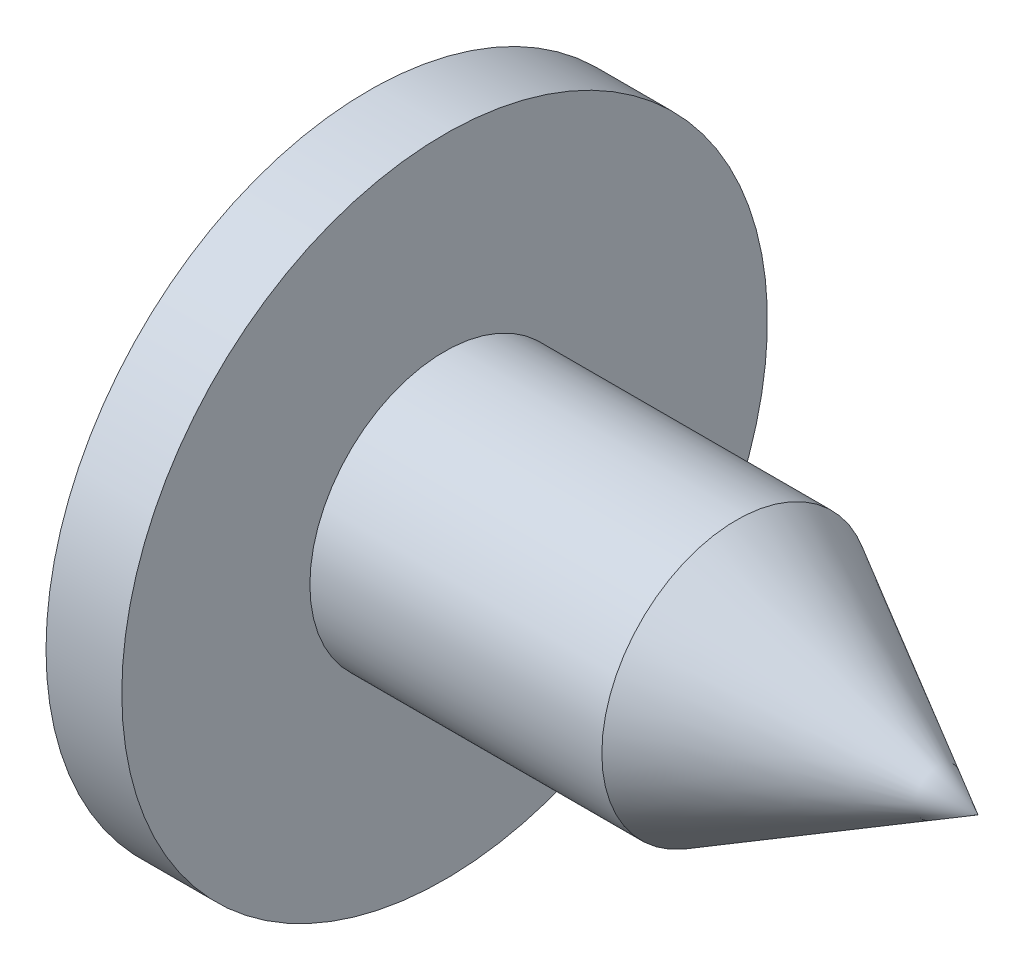
ISO-10303-21;
HEADER;
FILE_DESCRIPTION(('STEP AP214'),'2;1');
FILE_NAME('part.step','',(''),(''),'','','');
FILE_SCHEMA(('AUTOMOTIVE_DESIGN { 1 0 10303 214 1 1 1 1 }'));
ENDSEC;
DATA;
#1=APPLICATION_CONTEXT('core data for automotive mechanical design processes');
#2=APPLICATION_PROTOCOL_DEFINITION('international standard','automotive_design',2000,#1);
#3=PRODUCT_CONTEXT('',#1,'mechanical');
#4=PRODUCT('Part','Part','',(#3));
#5=PRODUCT_RELATED_PRODUCT_CATEGORY('part','',(#4));
#6=PRODUCT_DEFINITION_FORMATION('','',#4);
#7=PRODUCT_DEFINITION_CONTEXT('part definition',#1,'design');
#8=PRODUCT_DEFINITION('design','',#6,#7);
#9=PRODUCT_DEFINITION_SHAPE('','',#8);
#10=(LENGTH_UNIT() NAMED_UNIT(*) SI_UNIT(.MILLI.,.METRE.));
#11=(NAMED_UNIT(*) PLANE_ANGLE_UNIT() SI_UNIT($,.RADIAN.));
#12=(NAMED_UNIT(*) SI_UNIT($,.STERADIAN.) SOLID_ANGLE_UNIT());
#13=UNCERTAINTY_MEASURE_WITH_UNIT(LENGTH_MEASURE(1.E-05),#10,'distance_accuracy_value','');
#14=(GEOMETRIC_REPRESENTATION_CONTEXT(3) GLOBAL_UNCERTAINTY_ASSIGNED_CONTEXT((#13)) GLOBAL_UNIT_ASSIGNED_CONTEXT((#10,
#11,#12)) REPRESENTATION_CONTEXT('',''));
#15=CARTESIAN_POINT('',(0.,0.,0.));
#16=DIRECTION('',(0.,0.,1.));
#17=DIRECTION('',(1.,0.,0.));
#18=AXIS2_PLACEMENT_3D('',#15,#16,#17);
#19=CARTESIAN_POINT('',(3.05,0.,0.));
#20=DIRECTION('',(-1.,0.,0.));
#21=DIRECTION('',(0.,1.,0.));
#22=AXIS2_PLACEMENT_3D('',#19,#20,#21);
#23=SPHERICAL_SURFACE('',#22,6.6);
#24=CARTESIAN_POINT('',(-1.35,0.,0.));
#25=DIRECTION('',(-1.,0.,0.));
#26=DIRECTION('',(0.,0.,1.));
#27=AXIS2_PLACEMENT_3D('',#24,#25,#26);
#28=CIRCLE('',#27,4.91934955049953);
#29=CARTESIAN_POINT('',(-1.35,0.,4.91934955049953));
#30=VERTEX_POINT('',#29);
#31=EDGE_CURVE('E544',#30,#30,#28,.T.);
#32=ORIENTED_EDGE('',*,*,#31,.T.);
#33=EDGE_LOOP('',(#32));
#34=FACE_BOUND('',#33,.T.);
#35=CARTESIAN_POINT('',(2.9910729355507,0.,0.41928785021152));
#36=DIRECTION('',(-0.139173100960066,0.,0.99026806874157));
#37=DIRECTION('',(0.99026806874157,0.,0.139173100960066));
#38=AXIS2_PLACEMENT_3D('',#35,#36,#37);
#39=CIRCLE('',#38,6.58640458062974);
#40=CARTESIAN_POINT('',(-3.46986983546637,-0.901350135100591,-0.488738439791603));
#41=VERTEX_POINT('',#40);
#42=CARTESIAN_POINT('',(-3.14968174112773,-2.21969413745465,-0.443738937751484));
#43=VERTEX_POINT('',#42);
#44=EDGE_CURVE('E262',#41,#43,#39,.T.);
#45=ORIENTED_EDGE('',*,*,#44,.F.);
#46=CARTESIAN_POINT('',(-3.46986983546637,-0.901350135100592,-0.488738439791603));
#47=CARTESIAN_POINT('',(-3.47304924873914,-0.878129830106261,-0.489165172042078));
#48=CARTESIAN_POINT('',(-3.47594920651021,-0.854915698480102,-0.491589177292262));
#49=CARTESIAN_POINT('',(-3.48111988024279,-0.809162194857248,-0.500273532954115));
#50=CARTESIAN_POINT('',(-3.4833910818934,-0.78662231410156,-0.506530910165482));
#51=CARTESIAN_POINT('',(-3.4872399763901,-0.742831209379798,-0.522728852489197));
#52=CARTESIAN_POINT('',(-3.48881733461709,-0.721580611444196,-0.532671190494041));
#53=CARTESIAN_POINT('',(-3.49123292421502,-0.680986066779768,-0.555948097172701));
#54=CARTESIAN_POINT('',(-3.4920712945597,-0.661641762162296,-0.569282027417165));
#55=CARTESIAN_POINT('',(-3.49298537164809,-0.625405010318843,-0.59896565504239));
#56=CARTESIAN_POINT('',(-3.49306109683292,-0.608512503816986,-0.615315279492538));
#57=CARTESIAN_POINT('',(-3.49244767441931,-0.577654389720001,-0.650571089138518));
#58=CARTESIAN_POINT('',(-3.49175834677971,-0.563689471998954,-0.669477875195878));
#59=CARTESIAN_POINT('',(-3.48963421475739,-0.539085453086739,-0.709310040232108));
#60=CARTESIAN_POINT('',(-3.48819922617123,-0.528447174728495,-0.730235916953955));
#61=CARTESIAN_POINT('',(-3.48462426424543,-0.510808283126692,-0.773504118163124));
#62=CARTESIAN_POINT('',(-3.48248480623913,-0.503805020416462,-0.795845397635884));
#63=CARTESIAN_POINT('',(-3.47855104061412,-0.495665160757729,-0.832186870652789));
#64=CARTESIAN_POINT('',(-3.47696131563885,-0.493302356290953,-0.845946594751364));
#65=CARTESIAN_POINT('',(-3.47357041763564,-0.489973133427954,-0.873585550624749));
#66=CARTESIAN_POINT('',(-3.47176958619303,-0.489004492002053,-0.887464556567356));
#67=CARTESIAN_POINT('',(-3.46986983546637,-0.488738439791604,-0.90135013510059));
#68=B_SPLINE_CURVE_WITH_KNOTS('',3,(#46,#47,#48,#49,#50,#51,#52,#53,#54,#55,#56,#57,#58,#59,#60,
#61,#62,#63,#64,#65,#66,#67),.UNSPECIFIED.,.F.,.F.,(4,2,2,2,2,2,2,2,2,2,4),(0.,
0.0702290995303257,0.14040379753497,0.210612301607931,0.280807599482197,0.351001199997685,
0.421211322795477,0.491438798116696,0.56161501435542,0.603703827168205,0.645725453626422),.UNSPECIFIED.);
#69=CARTESIAN_POINT('',(-3.46986983546636,-0.488738439791604,-0.90135013510059));
#70=VERTEX_POINT('',#69);
#71=EDGE_CURVE('E206',#41,#70,#68,.T.);
#72=ORIENTED_EDGE('',*,*,#71,.T.);
#73=CARTESIAN_POINT('',(2.9910729355507,0.419287850211519,0.));
#74=DIRECTION('',(-0.139173100960066,0.99026806874157,0.));
#75=DIRECTION('',(-0.99026806874157,-0.139173100960066,0.));
#76=AXIS2_PLACEMENT_3D('',#73,#74,#75);
#77=CIRCLE('',#76,6.58640458062974);
#78=CARTESIAN_POINT('',(-3.14968174112773,-0.443738937751484,-2.21969413745465));
#79=VERTEX_POINT('',#78);
#80=EDGE_CURVE('E260',#79,#70,#77,.T.);
#81=ORIENTED_EDGE('',*,*,#80,.F.);
#82=CARTESIAN_POINT('',(2.05328224895708,0.,1.42346046943642));
#83=DIRECTION('',(-0.573576436351047,0.,0.819152044288991));
#84=DIRECTION('',(0.819152044288991,0.,0.573576436351047));
#85=AXIS2_PLACEMENT_3D('',#82,#83,#84);
#86=CIRCLE('',#85,6.36712761115307);
#87=CARTESIAN_POINT('',(-3.14968174112774,0.443738937751483,-2.21969413745465));
#88=VERTEX_POINT('',#87);
#89=EDGE_CURVE('E270',#88,#79,#86,.T.);
#90=ORIENTED_EDGE('',*,*,#89,.F.);
#91=CARTESIAN_POINT('',(2.9910729355507,-0.419287850211521,0.));
#92=DIRECTION('',(-0.139173100960066,-0.99026806874157,0.));
#93=DIRECTION('',(0.99026806874157,-0.139173100960066,0.));
#94=AXIS2_PLACEMENT_3D('',#91,#92,#93);
#95=CIRCLE('',#94,6.58640458062974);
#96=CARTESIAN_POINT('',(-3.46986983546637,0.488738439791602,-0.90135013510059));
#97=VERTEX_POINT('',#96);
#98=EDGE_CURVE('E319',#97,#88,#95,.T.);
#99=ORIENTED_EDGE('',*,*,#98,.F.);
#100=CARTESIAN_POINT('',(-3.46986983546637,0.488738439791602,-0.90135013510059));
#101=CARTESIAN_POINT('',(-3.47304924873914,0.489165172042077,-0.87812983010626));
#102=CARTESIAN_POINT('',(-3.47594920651021,0.491589177292261,-0.854915698480101));
#103=CARTESIAN_POINT('',(-3.48111988024279,0.500273532954114,-0.809162194857247));
#104=CARTESIAN_POINT('',(-3.4833910818934,0.506530910165481,-0.786622314101559));
#105=CARTESIAN_POINT('',(-3.4872399763901,0.522728852489197,-0.742831209379798));
#106=CARTESIAN_POINT('',(-3.48881733461709,0.53267119049404,-0.721580611444195));
#107=CARTESIAN_POINT('',(-3.49123292421502,0.5559480971727,-0.680986066779767));
#108=CARTESIAN_POINT('',(-3.4920712945597,0.569282027417164,-0.661641762162295));
#109=CARTESIAN_POINT('',(-3.49298537164809,0.598965655042389,-0.625405010318842));
#110=CARTESIAN_POINT('',(-3.49306109683292,0.615315279492537,-0.608512503816985));
#111=CARTESIAN_POINT('',(-3.49244767441932,0.650571089138517,-0.57765438972));
#112=CARTESIAN_POINT('',(-3.49175834677971,0.669477875195877,-0.563689471998953));
#113=CARTESIAN_POINT('',(-3.48963421475739,0.709310040232107,-0.539085453086738));
#114=CARTESIAN_POINT('',(-3.48819922617123,0.730235916953954,-0.528447174728494));
#115=CARTESIAN_POINT('',(-3.48462426424543,0.773504118163123,-0.51080828312669));
#116=CARTESIAN_POINT('',(-3.48248480623913,0.795845397635882,-0.503805020416461));
#117=CARTESIAN_POINT('',(-3.47855104061412,0.832186870652788,-0.495665160757727));
#118=CARTESIAN_POINT('',(-3.47696131563885,0.845946594751363,-0.493302356290952));
#119=CARTESIAN_POINT('',(-3.47357041763564,0.873585550624749,-0.489973133427953));
#120=CARTESIAN_POINT('',(-3.47176958619303,0.887464556567355,-0.489004492002052));
#121=CARTESIAN_POINT('',(-3.46986983546637,0.90135013510059,-0.488738439791603));
#122=B_SPLINE_CURVE_WITH_KNOTS('',3,(#100,#101,#102,#103,#104,#105,#106,#107,#108,#109,#110,
#111,#112,#113,#114,#115,#116,#117,#118,#119,#120,#121),.UNSPECIFIED.,.F.,.F.,(4,2,2,2,2,2,2,2,
2,2,4),(0.,0.0702290995303255,0.14040379753497,0.210612301607931,0.280807599482197,
0.351001199997685,0.421211322795477,0.491438798116695,0.56161501435542,0.603703827168205,
0.645725453626423),.UNSPECIFIED.);
#123=CARTESIAN_POINT('',(-3.46986983546637,0.90135013510059,-0.488738439791603));
#124=VERTEX_POINT('',#123);
#125=EDGE_CURVE('E185',#97,#124,#122,.T.);
#126=ORIENTED_EDGE('',*,*,#125,.T.);
#127=CARTESIAN_POINT('',(2.9910729355507,0.,0.41928785021152));
#128=DIRECTION('',(-0.139173100960066,0.,0.99026806874157));
#129=DIRECTION('',(0.99026806874157,0.,0.139173100960066));
#130=AXIS2_PLACEMENT_3D('',#127,#128,#129);
#131=CIRCLE('',#130,6.58640458062974);
#132=CARTESIAN_POINT('',(-3.14968174112773,2.21969413745465,-0.443738937751484));
#133=VERTEX_POINT('',#132);
#134=EDGE_CURVE('E297',#133,#124,#131,.T.);
#135=ORIENTED_EDGE('',*,*,#134,.F.);
#136=CARTESIAN_POINT('',(2.05328224895708,-1.42346046943642,0.));
#137=DIRECTION('',(-0.573576436351047,-0.819152044288991,0.));
#138=DIRECTION('',(0.819152044288991,-0.573576436351047,0.));
#139=AXIS2_PLACEMENT_3D('',#136,#137,#138);
#140=CIRCLE('',#139,6.36712761115307);
#141=CARTESIAN_POINT('',(-3.14968174112773,2.21969413745465,0.443738937751484));
#142=VERTEX_POINT('',#141);
#143=EDGE_CURVE('E298',#142,#133,#140,.T.);
#144=ORIENTED_EDGE('',*,*,#143,.F.);
#145=CARTESIAN_POINT('',(2.9910729355507,0.,-0.41928785021152));
#146=DIRECTION('',(-0.139173100960066,0.,-0.99026806874157));
#147=DIRECTION('',(-0.99026806874157,0.,0.139173100960066));
#148=AXIS2_PLACEMENT_3D('',#145,#146,#147);
#149=CIRCLE('',#148,6.58640458062974);
#150=CARTESIAN_POINT('',(-3.46986983546637,0.90135013510059,0.488738439791603));
#151=VERTEX_POINT('',#150);
#152=EDGE_CURVE('E302',#151,#142,#149,.T.);
#153=ORIENTED_EDGE('',*,*,#152,.F.);
#154=CARTESIAN_POINT('',(-3.46986983546637,0.90135013510059,0.488738439791603));
#155=CARTESIAN_POINT('',(-3.47304924873914,0.87812983010626,0.489165172042078));
#156=CARTESIAN_POINT('',(-3.47594920651021,0.8549156984801,0.491589177292262));
#157=CARTESIAN_POINT('',(-3.48111988024279,0.809162194857247,0.500273532954114));
#158=CARTESIAN_POINT('',(-3.4833910818934,0.786622314101558,0.506530910165482));
#159=CARTESIAN_POINT('',(-3.4872399763901,0.742831209379797,0.522728852489197));
#160=CARTESIAN_POINT('',(-3.48881733461709,0.721580611444194,0.532671190494041));
#161=CARTESIAN_POINT('',(-3.49123292421502,0.680986066779766,0.555948097172701));
#162=CARTESIAN_POINT('',(-3.4920712945597,0.661641762162295,0.569282027417165));
#163=CARTESIAN_POINT('',(-3.49298537164809,0.625405010318841,0.59896565504239));
#164=CARTESIAN_POINT('',(-3.49306109683292,0.608512503816985,0.615315279492538));
#165=CARTESIAN_POINT('',(-3.49244767441932,0.577654389719999,0.650571089138518));
#166=CARTESIAN_POINT('',(-3.49175834677971,0.563689471998952,0.669477875195877));
#167=CARTESIAN_POINT('',(-3.48963421475739,0.539085453086738,0.709310040232107));
#168=CARTESIAN_POINT('',(-3.48819922617123,0.528447174728493,0.730235916953954));
#169=CARTESIAN_POINT('',(-3.48462426424543,0.51080828312669,0.773504118163123));
#170=CARTESIAN_POINT('',(-3.48248480623913,0.50380502041646,0.795845397635883));
#171=CARTESIAN_POINT('',(-3.47855104061412,0.495665160757727,0.832186870652789));
#172=CARTESIAN_POINT('',(-3.47696131563885,0.493302356290952,0.845946594751364));
#173=CARTESIAN_POINT('',(-3.47357041763564,0.489973133427952,0.873585550624749));
#174=CARTESIAN_POINT('',(-3.47176958619303,0.489004492002051,0.887464556567356));
#175=CARTESIAN_POINT('',(-3.46986983546637,0.488738439791602,0.90135013510059));
#176=B_SPLINE_CURVE_WITH_KNOTS('',3,(#154,#155,#156,#157,#158,#159,#160,#161,#162,#163,#164,
#165,#166,#167,#168,#169,#170,#171,#172,#173,#174,#175),.UNSPECIFIED.,.F.,.F.,(4,2,2,2,2,2,2,2,
2,2,4),(0.,0.0702290995303257,0.14040379753497,0.210612301607931,0.280807599482197,
0.351001199997685,0.421211322795477,0.491438798116695,0.56161501435542,0.603703827168205,
0.645725453626422),.UNSPECIFIED.);
#177=CARTESIAN_POINT('',(-3.46986983546637,0.488738439791602,0.90135013510059));
#178=VERTEX_POINT('',#177);
#179=EDGE_CURVE('E194',#151,#178,#176,.T.);
#180=ORIENTED_EDGE('',*,*,#179,.T.);
#181=CARTESIAN_POINT('',(2.9910729355507,-0.419287850211521,0.));
#182=DIRECTION('',(-0.139173100960066,-0.99026806874157,0.));
#183=DIRECTION('',(0.99026806874157,-0.139173100960066,0.));
#184=AXIS2_PLACEMENT_3D('',#181,#182,#183);
#185=CIRCLE('',#184,6.58640458062974);
#186=CARTESIAN_POINT('',(-3.14968174112774,0.443738937751483,2.21969413745465));
#187=VERTEX_POINT('',#186);
#188=EDGE_CURVE('E322',#187,#178,#185,.T.);
#189=ORIENTED_EDGE('',*,*,#188,.F.);
#190=CARTESIAN_POINT('',(2.05328224895708,0.,-1.42346046943642));
#191=DIRECTION('',(-0.573576436351047,0.,-0.819152044288991));
#192=DIRECTION('',(-0.819152044288991,0.,0.573576436351047));
#193=AXIS2_PLACEMENT_3D('',#190,#191,#192);
#194=CIRCLE('',#193,6.36712761115307);
#195=CARTESIAN_POINT('',(-3.14968174112773,-0.443738937751484,2.21969413745465));
#196=VERTEX_POINT('',#195);
#197=EDGE_CURVE('E325',#196,#187,#194,.T.);
#198=ORIENTED_EDGE('',*,*,#197,.F.);
#199=CARTESIAN_POINT('',(2.9910729355507,0.419287850211519,0.));
#200=DIRECTION('',(-0.139173100960066,0.99026806874157,0.));
#201=DIRECTION('',(-0.99026806874157,-0.139173100960066,0.));
#202=AXIS2_PLACEMENT_3D('',#199,#200,#201);
#203=CIRCLE('',#202,6.58640458062974);
#204=CARTESIAN_POINT('',(-3.46986983546636,-0.488738439791604,0.90135013510059));
#205=VERTEX_POINT('',#204);
#206=EDGE_CURVE('E341',#205,#196,#203,.T.);
#207=ORIENTED_EDGE('',*,*,#206,.F.);
#208=CARTESIAN_POINT('',(-3.46986983546637,-0.488738439791604,0.90135013510059));
#209=CARTESIAN_POINT('',(-3.47304924873914,-0.489165172042079,0.87812983010626));
#210=CARTESIAN_POINT('',(-3.47594920651021,-0.491589177292263,0.8549156984801));
#211=CARTESIAN_POINT('',(-3.48111988024279,-0.500273532954116,0.809162194857247));
#212=CARTESIAN_POINT('',(-3.4833910818934,-0.506530910165483,0.786622314101558));
#213=CARTESIAN_POINT('',(-3.4872399763901,-0.522728852489199,0.742831209379797));
#214=CARTESIAN_POINT('',(-3.48881733461709,-0.532671190494042,0.721580611444195));
#215=CARTESIAN_POINT('',(-3.49123292421502,-0.555948097172703,0.680986066779767));
#216=CARTESIAN_POINT('',(-3.4920712945597,-0.569282027417167,0.661641762162295));
#217=CARTESIAN_POINT('',(-3.49298537164809,-0.598965655042391,0.625405010318841));
#218=CARTESIAN_POINT('',(-3.49306109683292,-0.615315279492539,0.608512503816985));
#219=CARTESIAN_POINT('',(-3.49244767441931,-0.65057108913852,0.577654389719999));
#220=CARTESIAN_POINT('',(-3.49175834677971,-0.669477875195879,0.563689471998952));
#221=CARTESIAN_POINT('',(-3.48963421475739,-0.709310040232109,0.539085453086738));
#222=CARTESIAN_POINT('',(-3.48819922617123,-0.730235916953956,0.528447174728494));
#223=CARTESIAN_POINT('',(-3.48462426424543,-0.773504118163125,0.51080828312669));
#224=CARTESIAN_POINT('',(-3.48248480623913,-0.795845397635885,0.503805020416461));
#225=CARTESIAN_POINT('',(-3.47855104061412,-0.832186870652791,0.495665160757727));
#226=CARTESIAN_POINT('',(-3.47696131563885,-0.845946594751365,0.493302356290952));
#227=CARTESIAN_POINT('',(-3.47357041763564,-0.87358555062475,0.489973133427952));
#228=CARTESIAN_POINT('',(-3.47176958619303,-0.887464556567357,0.489004492002051));
#229=CARTESIAN_POINT('',(-3.46986983546637,-0.901350135100592,0.488738439791602));
#230=B_SPLINE_CURVE_WITH_KNOTS('',3,(#208,#209,#210,#211,#212,#213,#214,#215,#216,#217,#218,
#219,#220,#221,#222,#223,#224,#225,#226,#227,#228,#229),.UNSPECIFIED.,.F.,.F.,(4,2,2,2,2,2,2,2,
2,2,4),(0.,0.0702290995303255,0.14040379753497,0.210612301607931,0.280807599482197,
0.351001199997685,0.421211322795477,0.491438798116695,0.56161501435542,0.603703827168205,
0.645725453626422),.UNSPECIFIED.);
#231=CARTESIAN_POINT('',(-3.46986983546637,-0.901350135100592,0.488738439791603));
#232=VERTEX_POINT('',#231);
#233=EDGE_CURVE('E200',#205,#232,#230,.T.);
#234=ORIENTED_EDGE('',*,*,#233,.T.);
#235=CARTESIAN_POINT('',(2.9910729355507,0.,-0.41928785021152));
#236=DIRECTION('',(-0.139173100960066,0.,-0.99026806874157));
#237=DIRECTION('',(-0.99026806874157,0.,0.139173100960066));
#238=AXIS2_PLACEMENT_3D('',#235,#236,#237);
#239=CIRCLE('',#238,6.58640458062974);
#240=CARTESIAN_POINT('',(-3.14968174112773,-2.21969413745465,0.443738937751483));
#241=VERTEX_POINT('',#240);
#242=EDGE_CURVE('E338',#241,#232,#239,.T.);
#243=ORIENTED_EDGE('',*,*,#242,.F.);
#244=CARTESIAN_POINT('',(2.05328224895709,1.42346046943642,0.));
#245=DIRECTION('',(-0.573576436351047,0.819152044288991,0.));
#246=DIRECTION('',(-0.819152044288991,-0.573576436351047,0.));
#247=AXIS2_PLACEMENT_3D('',#244,#245,#246);
#248=CIRCLE('',#247,6.36712761115307);
#249=EDGE_CURVE('E296',#43,#241,#248,.T.);
#250=ORIENTED_EDGE('',*,*,#249,.F.);
#251=EDGE_LOOP('',(#45,#72,#81,#90,#99,#126,#135,#144,#153,#180,#189,#198,#207,#234,#243,#250));
#252=FACE_BOUND('',#251,.T.);
#253=ADVANCED_FACE('F35',(#34,#252),#23,.T.);
#254=CARTESIAN_POINT('',(-6.47830998605592,0.,0.));
#255=DIRECTION('',(-1.,0.,0.));
#256=DIRECTION('',(0.,0.,1.));
#257=AXIS2_PLACEMENT_3D('',#254,#255,#256);
#258=CYLINDRICAL_SURFACE('',#257,5.75);
#259=CARTESIAN_POINT('',(-1.35,0.,0.));
#260=DIRECTION('',(-1.,0.,0.));
#261=DIRECTION('',(0.,0.,1.));
#262=AXIS2_PLACEMENT_3D('',#259,#260,#261);
#263=CIRCLE('',#262,5.75);
#264=CARTESIAN_POINT('',(-1.35,0.,5.75));
#265=VERTEX_POINT('',#264);
#266=EDGE_CURVE('E321',#265,#265,#263,.T.);
#267=ORIENTED_EDGE('',*,*,#266,.F.);
#268=EDGE_LOOP('',(#267));
#269=FACE_BOUND('',#268,.T.);
#270=CARTESIAN_POINT('',(0.,0.,0.));
#271=DIRECTION('',(-1.,0.,0.));
#272=DIRECTION('',(0.,0.,1.));
#273=AXIS2_PLACEMENT_3D('',#270,#271,#272);
#274=CIRCLE('',#273,5.75);
#275=CARTESIAN_POINT('',(0.,0.,5.75));
#276=VERTEX_POINT('',#275);
#277=EDGE_CURVE('E549',#276,#276,#274,.T.);
#278=ORIENTED_EDGE('',*,*,#277,.T.);
#279=EDGE_LOOP('',(#278));
#280=FACE_BOUND('',#279,.T.);
#281=ADVANCED_FACE('F168',(#269,#280),#258,.T.);
#282=CARTESIAN_POINT('',(-1.35,5.75,0.));
#283=DIRECTION('',(1.,0.,0.));
#284=DIRECTION('',(0.,0.,-1.));
#285=AXIS2_PLACEMENT_3D('',#282,#283,#284);
#286=PLANE('',#285);
#287=ORIENTED_EDGE('',*,*,#31,.F.);
#288=EDGE_LOOP('',(#287));
#289=FACE_BOUND('',#288,.T.);
#290=ORIENTED_EDGE('',*,*,#266,.T.);
#291=EDGE_LOOP('',(#290));
#292=FACE_BOUND('',#291,.T.);
#293=ADVANCED_FACE('F174',(#289,#292),#286,.F.);
#294=CARTESIAN_POINT('',(-6.47830998605592,0.,0.));
#295=DIRECTION('',(-1.,0.,0.));
#296=DIRECTION('',(0.,0.,1.));
#297=AXIS2_PLACEMENT_3D('',#294,#295,#296);
#298=CYLINDRICAL_SURFACE('',#297,2.4);
#299=CARTESIAN_POINT('',(5.2,0.,0.));
#300=DIRECTION('',(-1.,0.,0.));
#301=DIRECTION('',(0.,0.,1.));
#302=AXIS2_PLACEMENT_3D('',#299,#300,#301);
#303=CIRCLE('',#302,2.4);
#304=CARTESIAN_POINT('',(5.2,0.,2.4));
#305=VERTEX_POINT('',#304);
#306=EDGE_CURVE('E309',#305,#305,#303,.T.);
#307=ORIENTED_EDGE('',*,*,#306,.T.);
#308=EDGE_LOOP('',(#307));
#309=FACE_BOUND('',#308,.T.);
#310=CARTESIAN_POINT('',(0.,0.,0.));
#311=DIRECTION('',(-1.,0.,0.));
#312=DIRECTION('',(0.,0.,1.));
#313=AXIS2_PLACEMENT_3D('',#310,#311,#312);
#314=CIRCLE('',#313,2.4);
#315=CARTESIAN_POINT('',(0.,0.,2.4));
#316=VERTEX_POINT('',#315);
#317=EDGE_CURVE('E547',#316,#316,#314,.T.);
#318=ORIENTED_EDGE('',*,*,#317,.F.);
#319=EDGE_LOOP('',(#318));
#320=FACE_BOUND('',#319,.T.);
#321=ADVANCED_FACE('F162',(#309,#320),#298,.T.);
#322=CARTESIAN_POINT('',(0.,5.75,0.));
#323=DIRECTION('',(-1.,0.,0.));
#324=DIRECTION('',(0.,0.,1.));
#325=AXIS2_PLACEMENT_3D('',#322,#323,#324);
#326=PLANE('',#325);
#327=ORIENTED_EDGE('',*,*,#277,.F.);
#328=EDGE_LOOP('',(#327));
#329=FACE_BOUND('',#328,.T.);
#330=ORIENTED_EDGE('',*,*,#317,.T.);
#331=EDGE_LOOP('',(#330));
#332=FACE_BOUND('',#331,.T.);
#333=ADVANCED_FACE('F153',(#329,#332),#326,.F.);
#334=CARTESIAN_POINT('',(9.5,0.,0.));
#335=DIRECTION('',(-1.,0.,0.));
#336=DIRECTION('',(0.,0.,1.));
#337=AXIS2_PLACEMENT_3D('',#334,#335,#336);
#338=CONICAL_SURFACE('',#337,0.,0.509070888422383);
#339=ORIENTED_EDGE('',*,*,#306,.F.);
#340=EDGE_LOOP('',(#339));
#341=FACE_BOUND('',#340,.T.);
#342=CARTESIAN_POINT('',(9.5,0.,0.));
#343=VERTEX_POINT('',#342);
#344=VERTEX_LOOP('',#343);
#345=FACE_BOUND('',#344,.T.);
#346=ADVANCED_FACE('F150',(#341,#345),#338,.T.);
#347=CARTESIAN_POINT('',(-3.55,0.,-0.499999999999999));
#348=DIRECTION('',(-0.139173100960066,0.,0.99026806874157));
#349=DIRECTION('',(0.99026806874157,0.,0.139173100960066));
#350=AXIS2_PLACEMENT_3D('',#347,#348,#349);
#351=PLANE('',#350);
#352=ORIENTED_EDGE('',*,*,#134,.T.);
#353=DIRECTION('',(-0.980814848463989,0.137844537491629,-0.137844537491629));
#354=VECTOR('',#353,1.);
#355=CARTESIAN_POINT('',(-3.42661492694698,0.8952710541523,-0.482659358843313));
#356=LINE('',#355,#354);
#357=CARTESIAN_POINT('',(-1.27,0.592178592187533,-0.179566896878546));
#358=VERTEX_POINT('',#357);
#359=EDGE_CURVE('E51',#124,#358,#356,.F.);
#360=ORIENTED_EDGE('',*,*,#359,.T.);
#361=DIRECTION('',(0.,1.,0.));
#362=VECTOR('',#361,1.);
#363=CARTESIAN_POINT('',(-1.27,0.,-0.179566896878546));
#364=LINE('',#363,#362);
#365=CARTESIAN_POINT('',(-1.27,0.903526812881856,-0.179566896878546));
#366=VERTEX_POINT('',#365);
#367=EDGE_CURVE('E311',#358,#366,#364,.T.);
#368=ORIENTED_EDGE('',*,*,#367,.T.);
#369=DIRECTION('',(-0.813777054443471,0.569812827943414,-0.114368906493139));
#370=VECTOR('',#369,1.);
#371=CARTESIAN_POINT('',(-3.50346460407705,2.46741556498117,-0.493459876613782));
#372=LINE('',#371,#370);
#373=EDGE_CURVE('E307',#366,#133,#372,.T.);
#374=ORIENTED_EDGE('',*,*,#373,.T.);
#375=EDGE_LOOP('',(#352,#360,#368,#374));
#376=FACE_BOUND('',#375,.T.);
#377=ADVANCED_FACE('F152',(#376),#351,.T.);
#378=CARTESIAN_POINT('',(-3.55,2.5,0.));
#379=DIRECTION('',(-0.573576436351047,-0.819152044288991,0.));
#380=DIRECTION('',(0.819152044288991,-0.573576436351047,0.));
#381=AXIS2_PLACEMENT_3D('',#378,#379,#380);
#382=PLANE('',#381);
#383=ORIENTED_EDGE('',*,*,#143,.T.);
#384=ORIENTED_EDGE('',*,*,#373,.F.);
#385=DIRECTION('',(0.,0.,1.));
#386=VECTOR('',#385,1.);
#387=CARTESIAN_POINT('',(-1.27,0.903526812881856,0.));
#388=LINE('',#387,#386);
#389=CARTESIAN_POINT('',(-1.27,0.903526812881856,0.179566896878546));
#390=VERTEX_POINT('',#389);
#391=EDGE_CURVE('E313',#366,#390,#388,.T.);
#392=ORIENTED_EDGE('',*,*,#391,.T.);
#393=DIRECTION('',(-0.813777054443471,0.569812827943414,0.114368906493139));
#394=VECTOR('',#393,1.);
#395=CARTESIAN_POINT('',(-2.39074848823026,1.68828335277782,0.337077824905871));
#396=LINE('',#395,#394);
#397=EDGE_CURVE('E310',#390,#142,#396,.T.);
#398=ORIENTED_EDGE('',*,*,#397,.T.);
#399=EDGE_LOOP('',(#383,#384,#392,#398));
#400=FACE_BOUND('',#399,.T.);
#401=ADVANCED_FACE('F160',(#400),#382,.T.);
#402=CARTESIAN_POINT('',(-3.55,0.,0.499999999999999));
#403=DIRECTION('',(-0.139173100960066,0.,-0.99026806874157));
#404=DIRECTION('',(-0.99026806874157,0.,0.139173100960066));
#405=AXIS2_PLACEMENT_3D('',#402,#403,#404);
#406=PLANE('',#405);
#407=DIRECTION('',(0.,-1.,0.));
#408=VECTOR('',#407,1.);
#409=CARTESIAN_POINT('',(-1.27,0.,0.179566896878546));
#410=LINE('',#409,#408);
#411=CARTESIAN_POINT('',(-1.27,0.592178592187533,0.179566896878546));
#412=VERTEX_POINT('',#411);
#413=EDGE_CURVE('E333',#390,#412,#410,.T.);
#414=ORIENTED_EDGE('',*,*,#413,.T.);
#415=DIRECTION('',(-0.980814848463989,0.137844537491629,0.137844537491629));
#416=VECTOR('',#415,1.);
#417=CARTESIAN_POINT('',(-3.42661492694698,0.8952710541523,0.482659358843313));
#418=LINE('',#417,#416);
#419=EDGE_CURVE('E233',#412,#151,#418,.T.);
#420=ORIENTED_EDGE('',*,*,#419,.T.);
#421=ORIENTED_EDGE('',*,*,#152,.T.);
#422=ORIENTED_EDGE('',*,*,#397,.F.);
#423=EDGE_LOOP('',(#414,#420,#421,#422));
#424=FACE_BOUND('',#423,.T.);
#425=ADVANCED_FACE('F383',(#424),#406,.T.);
#426=CARTESIAN_POINT('',(-3.55,0.499999999999999,0.));
#427=DIRECTION('',(-0.139173100960066,-0.99026806874157,0.));
#428=DIRECTION('',(0.99026806874157,-0.139173100960066,0.));
#429=AXIS2_PLACEMENT_3D('',#426,#427,#428);
#430=PLANE('',#429);
#431=ORIENTED_EDGE('',*,*,#188,.T.);
#432=DIRECTION('',(-0.980814848463989,0.137844537491629,0.137844537491629));
#433=VECTOR('',#432,1.);
#434=CARTESIAN_POINT('',(-3.42661492694698,0.482659358843312,0.8952710541523));
#435=LINE('',#434,#433);
#436=CARTESIAN_POINT('',(-1.27,0.179566896878546,0.592178592187534));
#437=VERTEX_POINT('',#436);
#438=EDGE_CURVE('E231',#178,#437,#435,.F.);
#439=ORIENTED_EDGE('',*,*,#438,.T.);
#440=DIRECTION('',(0.,0.,1.));
#441=VECTOR('',#440,1.);
#442=CARTESIAN_POINT('',(-1.27,0.179566896878546,0.));
#443=LINE('',#442,#441);
#444=CARTESIAN_POINT('',(-1.27,0.179566896878546,0.903526812881857));
#445=VERTEX_POINT('',#444);
#446=EDGE_CURVE('E330',#437,#445,#443,.T.);
#447=ORIENTED_EDGE('',*,*,#446,.T.);
#448=DIRECTION('',(-0.813777054443472,0.114368906493139,0.569812827943414));
#449=VECTOR('',#448,1.);
#450=CARTESIAN_POINT('',(-3.50346460407705,0.493459876613781,2.46741556498117));
#451=LINE('',#450,#449);
#452=EDGE_CURVE('E326',#445,#187,#451,.T.);
#453=ORIENTED_EDGE('',*,*,#452,.T.);
#454=EDGE_LOOP('',(#431,#439,#447,#453));
#455=FACE_BOUND('',#454,.T.);
#456=ADVANCED_FACE('F381',(#455),#430,.T.);
#457=CARTESIAN_POINT('',(-3.55,0.,2.5));
#458=DIRECTION('',(-0.573576436351047,0.,-0.819152044288991));
#459=DIRECTION('',(-0.819152044288991,0.,0.573576436351047));
#460=AXIS2_PLACEMENT_3D('',#457,#458,#459);
#461=PLANE('',#460);
#462=ORIENTED_EDGE('',*,*,#197,.T.);
#463=ORIENTED_EDGE('',*,*,#452,.F.);
#464=DIRECTION('',(0.,-1.,0.));
#465=VECTOR('',#464,1.);
#466=CARTESIAN_POINT('',(-1.27,0.,0.903526812881857));
#467=LINE('',#466,#465);
#468=CARTESIAN_POINT('',(-1.27,-0.179566896878548,0.903526812881857));
#469=VERTEX_POINT('',#468);
#470=EDGE_CURVE('E332',#445,#469,#467,.T.);
#471=ORIENTED_EDGE('',*,*,#470,.T.);
#472=DIRECTION('',(-0.813777054443472,-0.114368906493139,0.569812827943414));
#473=VECTOR('',#472,1.);
#474=CARTESIAN_POINT('',(-2.39074848823026,-0.337077824905872,1.68828335277782));
#475=LINE('',#474,#473);
#476=EDGE_CURVE('E329',#469,#196,#475,.T.);
#477=ORIENTED_EDGE('',*,*,#476,.T.);
#478=EDGE_LOOP('',(#462,#463,#471,#477));
#479=FACE_BOUND('',#478,.T.);
#480=ADVANCED_FACE('F370',(#479),#461,.T.);
#481=CARTESIAN_POINT('',(-3.55,-0.500000000000001,0.));
#482=DIRECTION('',(-0.139173100960066,0.99026806874157,0.));
#483=DIRECTION('',(-0.99026806874157,-0.139173100960066,0.));
#484=AXIS2_PLACEMENT_3D('',#481,#482,#483);
#485=PLANE('',#484);
#486=DIRECTION('',(0.,0.,-1.));
#487=VECTOR('',#486,1.);
#488=CARTESIAN_POINT('',(-1.27,-0.179566896878548,0.));
#489=LINE('',#488,#487);
#490=CARTESIAN_POINT('',(-1.27,-0.179566896878548,0.592178592187534));
#491=VERTEX_POINT('',#490);
#492=EDGE_CURVE('E345',#469,#491,#489,.T.);
#493=ORIENTED_EDGE('',*,*,#492,.T.);
#494=DIRECTION('',(-0.980814848463989,-0.137844537491629,0.137844537491629));
#495=VECTOR('',#494,1.);
#496=CARTESIAN_POINT('',(-3.42661492694698,-0.482659358843314,0.8952710541523));
#497=LINE('',#496,#495);
#498=EDGE_CURVE('E250',#491,#205,#497,.T.);
#499=ORIENTED_EDGE('',*,*,#498,.T.);
#500=ORIENTED_EDGE('',*,*,#206,.T.);
#501=ORIENTED_EDGE('',*,*,#476,.F.);
#502=EDGE_LOOP('',(#493,#499,#500,#501));
#503=FACE_BOUND('',#502,.T.);
#504=ADVANCED_FACE('F372',(#503),#485,.T.);
#505=CARTESIAN_POINT('',(-3.55,0.,0.499999999999999));
#506=DIRECTION('',(-0.139173100960066,0.,-0.99026806874157));
#507=DIRECTION('',(-0.99026806874157,0.,0.139173100960066));
#508=AXIS2_PLACEMENT_3D('',#505,#506,#507);
#509=PLANE('',#508);
#510=ORIENTED_EDGE('',*,*,#242,.T.);
#511=DIRECTION('',(-0.980814848463989,-0.137844537491629,0.137844537491629));
#512=VECTOR('',#511,1.);
#513=CARTESIAN_POINT('',(-3.42661492694698,-0.895271054152302,0.482659358843313));
#514=LINE('',#513,#512);
#515=CARTESIAN_POINT('',(-1.27,-0.592178592187535,0.179566896878546));
#516=VERTEX_POINT('',#515);
#517=EDGE_CURVE('E248',#232,#516,#514,.F.);
#518=ORIENTED_EDGE('',*,*,#517,.T.);
#519=DIRECTION('',(0.,-1.,0.));
#520=VECTOR('',#519,1.);
#521=CARTESIAN_POINT('',(-1.27,0.,0.179566896878546));
#522=LINE('',#521,#520);
#523=CARTESIAN_POINT('',(-1.27,-0.903526812881859,0.179566896878546));
#524=VERTEX_POINT('',#523);
#525=EDGE_CURVE('E290',#516,#524,#522,.T.);
#526=ORIENTED_EDGE('',*,*,#525,.T.);
#527=DIRECTION('',(-0.813777054443471,-0.569812827943414,0.114368906493139));
#528=VECTOR('',#527,1.);
#529=CARTESIAN_POINT('',(-3.50346460407705,-2.46741556498118,0.493459876613781));
#530=LINE('',#529,#528);
#531=EDGE_CURVE('E295',#524,#241,#530,.T.);
#532=ORIENTED_EDGE('',*,*,#531,.T.);
#533=EDGE_LOOP('',(#510,#518,#526,#532));
#534=FACE_BOUND('',#533,.T.);
#535=ADVANCED_FACE('F394',(#534),#509,.T.);
#536=CARTESIAN_POINT('',(-3.55,-2.5,0.));
#537=DIRECTION('',(-0.573576436351047,0.819152044288991,0.));
#538=DIRECTION('',(-0.819152044288991,-0.573576436351047,0.));
#539=AXIS2_PLACEMENT_3D('',#536,#537,#538);
#540=PLANE('',#539);
#541=ORIENTED_EDGE('',*,*,#249,.T.);
#542=ORIENTED_EDGE('',*,*,#531,.F.);
#543=DIRECTION('',(0.,0.,-1.));
#544=VECTOR('',#543,1.);
#545=CARTESIAN_POINT('',(-1.27,-0.903526812881859,0.));
#546=LINE('',#545,#544);
#547=CARTESIAN_POINT('',(-1.27,-0.903526812881859,-0.179566896878547));
#548=VERTEX_POINT('',#547);
#549=EDGE_CURVE('E286',#524,#548,#546,.T.);
#550=ORIENTED_EDGE('',*,*,#549,.T.);
#551=DIRECTION('',(-0.813777054443471,-0.569812827943414,-0.114368906493139));
#552=VECTOR('',#551,1.);
#553=CARTESIAN_POINT('',(-2.39074848823026,-1.68828335277782,-0.337077824905871));
#554=LINE('',#553,#552);
#555=EDGE_CURVE('E285',#548,#43,#554,.T.);
#556=ORIENTED_EDGE('',*,*,#555,.T.);
#557=EDGE_LOOP('',(#541,#542,#550,#556));
#558=FACE_BOUND('',#557,.T.);
#559=ADVANCED_FACE('F397',(#558),#540,.T.);
#560=CARTESIAN_POINT('',(-3.55,0.,-0.499999999999999));
#561=DIRECTION('',(-0.139173100960066,0.,0.99026806874157));
#562=DIRECTION('',(0.99026806874157,0.,0.139173100960066));
#563=AXIS2_PLACEMENT_3D('',#560,#561,#562);
#564=PLANE('',#563);
#565=DIRECTION('',(0.,1.,0.));
#566=VECTOR('',#565,1.);
#567=CARTESIAN_POINT('',(-1.27,0.,-0.179566896878546));
#568=LINE('',#567,#566);
#569=CARTESIAN_POINT('',(-1.27,-0.592178592187535,-0.179566896878547));
#570=VERTEX_POINT('',#569);
#571=EDGE_CURVE('E278',#548,#570,#568,.T.);
#572=ORIENTED_EDGE('',*,*,#571,.T.);
#573=DIRECTION('',(-0.980814848463989,-0.137844537491629,-0.137844537491629));
#574=VECTOR('',#573,1.);
#575=CARTESIAN_POINT('',(-3.42661492694698,-0.895271054152302,-0.482659358843313));
#576=LINE('',#575,#574);
#577=EDGE_CURVE('E273',#570,#41,#576,.T.);
#578=ORIENTED_EDGE('',*,*,#577,.T.);
#579=ORIENTED_EDGE('',*,*,#44,.T.);
#580=ORIENTED_EDGE('',*,*,#555,.F.);
#581=EDGE_LOOP('',(#572,#578,#579,#580));
#582=FACE_BOUND('',#581,.T.);
#583=ADVANCED_FACE('F283',(#582),#564,.T.);
#584=CARTESIAN_POINT('',(-3.55,-0.500000000000001,0.));
#585=DIRECTION('',(-0.139173100960066,0.99026806874157,0.));
#586=DIRECTION('',(-0.99026806874157,-0.139173100960066,0.));
#587=AXIS2_PLACEMENT_3D('',#584,#585,#586);
#588=PLANE('',#587);
#589=ORIENTED_EDGE('',*,*,#80,.T.);
#590=DIRECTION('',(-0.980814848463989,-0.137844537491629,-0.137844537491629));
#591=VECTOR('',#590,1.);
#592=CARTESIAN_POINT('',(-3.42661492694698,-0.482659358843314,-0.895271054152301));
#593=LINE('',#592,#591);
#594=CARTESIAN_POINT('',(-1.27,-0.179566896878548,-0.592178592187534));
#595=VERTEX_POINT('',#594);
#596=EDGE_CURVE('E252',#70,#595,#593,.F.);
#597=ORIENTED_EDGE('',*,*,#596,.T.);
#598=DIRECTION('',(0.,0.,-1.));
#599=VECTOR('',#598,1.);
#600=CARTESIAN_POINT('',(-1.27,-0.179566896878548,0.));
#601=LINE('',#600,#599);
#602=CARTESIAN_POINT('',(-1.27,-0.179566896878548,-0.903526812881857));
#603=VERTEX_POINT('',#602);
#604=EDGE_CURVE('E280',#595,#603,#601,.T.);
#605=ORIENTED_EDGE('',*,*,#604,.T.);
#606=DIRECTION('',(-0.813777054443472,-0.114368906493139,-0.569812827943414));
#607=VECTOR('',#606,1.);
#608=CARTESIAN_POINT('',(-3.50346460407705,-0.493459876613783,-2.46741556498117));
#609=LINE('',#608,#607);
#610=EDGE_CURVE('E269',#603,#79,#609,.T.);
#611=ORIENTED_EDGE('',*,*,#610,.T.);
#612=EDGE_LOOP('',(#589,#597,#605,#611));
#613=FACE_BOUND('',#612,.T.);
#614=ADVANCED_FACE('F267',(#613),#588,.T.);
#615=CARTESIAN_POINT('',(-3.55,0.,-2.5));
#616=DIRECTION('',(-0.573576436351047,0.,0.819152044288991));
#617=DIRECTION('',(0.819152044288991,0.,0.573576436351047));
#618=AXIS2_PLACEMENT_3D('',#615,#616,#617);
#619=PLANE('',#618);
#620=ORIENTED_EDGE('',*,*,#89,.T.);
#621=ORIENTED_EDGE('',*,*,#610,.F.);
#622=DIRECTION('',(0.,1.,0.));
#623=VECTOR('',#622,1.);
#624=CARTESIAN_POINT('',(-1.27,0.,-0.903526812881857));
#625=LINE('',#624,#623);
#626=CARTESIAN_POINT('',(-1.27,0.179566896878546,-0.903526812881857));
#627=VERTEX_POINT('',#626);
#628=EDGE_CURVE('E288',#603,#627,#625,.T.);
#629=ORIENTED_EDGE('',*,*,#628,.T.);
#630=DIRECTION('',(-0.813777054443472,0.114368906493139,-0.569812827943414));
#631=VECTOR('',#630,1.);
#632=CARTESIAN_POINT('',(-2.39074848823026,0.33707782490587,-1.68828335277782));
#633=LINE('',#632,#631);
#634=EDGE_CURVE('E316',#627,#88,#633,.T.);
#635=ORIENTED_EDGE('',*,*,#634,.T.);
#636=EDGE_LOOP('',(#620,#621,#629,#635));
#637=FACE_BOUND('',#636,.T.);
#638=ADVANCED_FACE('F358',(#637),#619,.T.);
#639=CARTESIAN_POINT('',(-3.55,0.499999999999999,0.));
#640=DIRECTION('',(-0.139173100960066,-0.99026806874157,0.));
#641=DIRECTION('',(0.99026806874157,-0.139173100960066,0.));
#642=AXIS2_PLACEMENT_3D('',#639,#640,#641);
#643=PLANE('',#642);
#644=DIRECTION('',(0.,0.,1.));
#645=VECTOR('',#644,1.);
#646=CARTESIAN_POINT('',(-1.27,0.179566896878546,0.));
#647=LINE('',#646,#645);
#648=CARTESIAN_POINT('',(-1.27,0.179566896878546,-0.592178592187534));
#649=VERTEX_POINT('',#648);
#650=EDGE_CURVE('E314',#627,#649,#647,.T.);
#651=ORIENTED_EDGE('',*,*,#650,.T.);
#652=DIRECTION('',(-0.980814848463989,0.137844537491629,-0.137844537491629));
#653=VECTOR('',#652,1.);
#654=CARTESIAN_POINT('',(-3.42661492694698,0.482659358843312,-0.895271054152301));
#655=LINE('',#654,#653);
#656=EDGE_CURVE('E243',#649,#97,#655,.T.);
#657=ORIENTED_EDGE('',*,*,#656,.T.);
#658=ORIENTED_EDGE('',*,*,#98,.T.);
#659=ORIENTED_EDGE('',*,*,#634,.F.);
#660=EDGE_LOOP('',(#651,#657,#658,#659));
#661=FACE_BOUND('',#660,.T.);
#662=ADVANCED_FACE('F362',(#661),#643,.T.);
#663=CARTESIAN_POINT('',(-1.27,0.499999999999999,-0.5));
#664=DIRECTION('',(1.,0.,0.));
#665=DIRECTION('',(0.,0.,-1.));
#666=AXIS2_PLACEMENT_3D('',#663,#664,#665);
#667=PLANE('',#666);
#668=ORIENTED_EDGE('',*,*,#367,.F.);
#669=CARTESIAN_POINT('',(-1.27,0.60032838542797,-0.600328385427971));
#670=DIRECTION('',(1.,0.,0.));
#671=DIRECTION('',(0.,0.707106781186547,-0.707106781186548));
#672=AXIS2_PLACEMENT_3D('',#669,#670,#671);
#673=ELLIPSE('',#672,0.424816842158528,0.416666666666667);
#674=EDGE_CURVE('E11',#358,#649,#673,.T.);
#675=ORIENTED_EDGE('',*,*,#674,.T.);
#676=ORIENTED_EDGE('',*,*,#650,.F.);
#677=ORIENTED_EDGE('',*,*,#628,.F.);
#678=ORIENTED_EDGE('',*,*,#604,.F.);
#679=CARTESIAN_POINT('',(-1.27,-0.600328385427972,-0.600328385427971));
#680=DIRECTION('',(1.,0.,0.));
#681=DIRECTION('',(0.,-0.707106781186547,-0.707106781186548));
#682=AXIS2_PLACEMENT_3D('',#679,#680,#681);
#683=ELLIPSE('',#682,0.424816842158528,0.416666666666667);
#684=EDGE_CURVE('E238',#595,#570,#683,.T.);
#685=ORIENTED_EDGE('',*,*,#684,.T.);
#686=ORIENTED_EDGE('',*,*,#571,.F.);
#687=ORIENTED_EDGE('',*,*,#549,.F.);
#688=ORIENTED_EDGE('',*,*,#525,.F.);
#689=CARTESIAN_POINT('',(-1.27,-0.600328385427972,0.600328385427971));
#690=DIRECTION('',(1.,0.,0.));
#691=DIRECTION('',(0.,-0.707106781186548,0.707106781186547));
#692=AXIS2_PLACEMENT_3D('',#689,#690,#691);
#693=ELLIPSE('',#692,0.424816842158528,0.416666666666667);
#694=EDGE_CURVE('E237',#516,#491,#693,.T.);
#695=ORIENTED_EDGE('',*,*,#694,.T.);
#696=ORIENTED_EDGE('',*,*,#492,.F.);
#697=ORIENTED_EDGE('',*,*,#470,.F.);
#698=ORIENTED_EDGE('',*,*,#446,.F.);
#699=CARTESIAN_POINT('',(-1.27,0.60032838542797,0.600328385427971));
#700=DIRECTION('',(1.,0.,0.));
#701=DIRECTION('',(0.,0.707106781186547,0.707106781186548));
#702=AXIS2_PLACEMENT_3D('',#699,#700,#701);
#703=ELLIPSE('',#702,0.424816842158528,0.416666666666667);
#704=EDGE_CURVE('E44',#437,#412,#703,.T.);
#705=ORIENTED_EDGE('',*,*,#704,.T.);
#706=ORIENTED_EDGE('',*,*,#413,.F.);
#707=ORIENTED_EDGE('',*,*,#391,.F.);
#708=EDGE_LOOP('',(#668,#675,#676,#677,#678,#685,#686,#687,#688,#695,#696,#697,#698,#705,#706,#707));
#709=FACE_BOUND('',#708,.T.);
#710=ADVANCED_FACE('F276',(#709),#667,.F.);
#711=CARTESIAN_POINT('',(-3.36862613488029,-0.895271054152301,-0.895271054152301));
#712=DIRECTION('',(-0.980814848463989,-0.137844537491629,-0.137844537491629));
#713=DIRECTION('',(-0.139173100960066,0.,0.99026806874157));
#714=AXIS2_PLACEMENT_3D('',#711,#712,#713);
#715=CYLINDRICAL_SURFACE('',#714,0.416666666666667);
#716=ORIENTED_EDGE('',*,*,#684,.F.);
#717=ORIENTED_EDGE('',*,*,#596,.F.);
#718=ORIENTED_EDGE('',*,*,#71,.F.);
#719=ORIENTED_EDGE('',*,*,#577,.F.);
#720=EDGE_LOOP('',(#716,#717,#718,#719));
#721=FACE_BOUND('',#720,.T.);
#722=ADVANCED_FACE('F217',(#721),#715,.T.);
#723=CARTESIAN_POINT('',(-3.36862613488029,-0.895271054152302,0.8952710541523));
#724=DIRECTION('',(-0.980814848463989,-0.137844537491629,0.137844537491629));
#725=DIRECTION('',(0.139173100960066,-0.99026806874157,0.));
#726=AXIS2_PLACEMENT_3D('',#723,#724,#725);
#727=CYLINDRICAL_SURFACE('',#726,0.416666666666667);
#728=ORIENTED_EDGE('',*,*,#694,.F.);
#729=ORIENTED_EDGE('',*,*,#517,.F.);
#730=ORIENTED_EDGE('',*,*,#233,.F.);
#731=ORIENTED_EDGE('',*,*,#498,.F.);
#732=EDGE_LOOP('',(#728,#729,#730,#731));
#733=FACE_BOUND('',#732,.T.);
#734=ADVANCED_FACE('F213',(#733),#727,.T.);
#735=CARTESIAN_POINT('',(-3.36862613488029,0.8952710541523,0.8952710541523));
#736=DIRECTION('',(-0.980814848463989,0.137844537491629,0.137844537491629));
#737=DIRECTION('',(0.139173100960066,0.,0.99026806874157));
#738=AXIS2_PLACEMENT_3D('',#735,#736,#737);
#739=CYLINDRICAL_SURFACE('',#738,0.416666666666667);
#740=ORIENTED_EDGE('',*,*,#704,.F.);
#741=ORIENTED_EDGE('',*,*,#438,.F.);
#742=ORIENTED_EDGE('',*,*,#179,.F.);
#743=ORIENTED_EDGE('',*,*,#419,.F.);
#744=EDGE_LOOP('',(#740,#741,#742,#743));
#745=FACE_BOUND('',#744,.T.);
#746=ADVANCED_FACE('F216',(#745),#739,.T.);
#747=CARTESIAN_POINT('',(-3.36862613488029,0.8952710541523,-0.8952710541523));
#748=DIRECTION('',(-0.980814848463989,0.137844537491629,-0.137844537491629));
#749=DIRECTION('',(-0.139173100960066,0.,0.99026806874157));
#750=AXIS2_PLACEMENT_3D('',#747,#748,#749);
#751=CYLINDRICAL_SURFACE('',#750,0.416666666666667);
#752=ORIENTED_EDGE('',*,*,#674,.F.);
#753=ORIENTED_EDGE('',*,*,#359,.F.);
#754=ORIENTED_EDGE('',*,*,#125,.F.);
#755=ORIENTED_EDGE('',*,*,#656,.F.);
#756=EDGE_LOOP('',(#752,#753,#754,#755));
#757=FACE_BOUND('',#756,.T.);
#758=ADVANCED_FACE('F37',(#757),#751,.T.);
#759=CLOSED_SHELL('',(#253,#281,#293,#321,#333,#346,#377,#401,#425,#456,#480,#504,#535,#559,
#583,#614,#638,#662,#710,#722,#734,#746,#758));
#760=MANIFOLD_SOLID_BREP('B2',#759);
#761=ADVANCED_BREP_SHAPE_REPRESENTATION('',(#18,#760),#14);
#762=SHAPE_DEFINITION_REPRESENTATION(#9,#761);
ENDSEC;
END-ISO-10303-21;
